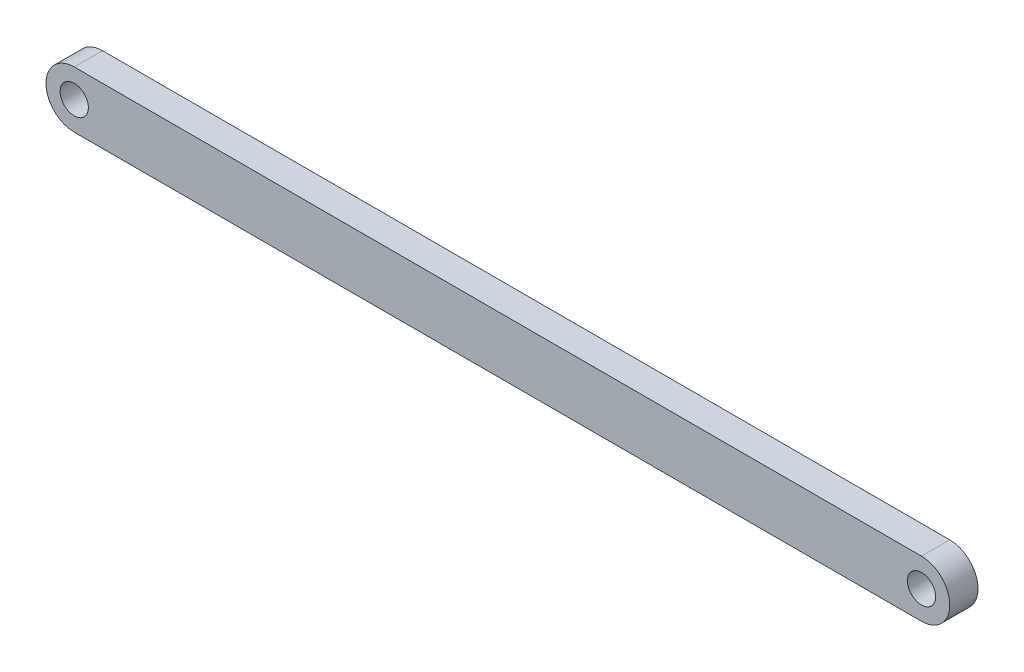
ISO-10303-21;
HEADER;
FILE_DESCRIPTION(('STEP AP214'),'2;1');
FILE_NAME('part.step','',(''),(''),'','','');
FILE_SCHEMA(('AUTOMOTIVE_DESIGN { 1 0 10303 214 1 1 1 1 }'));
ENDSEC;
DATA;
#1=APPLICATION_CONTEXT('core data for automotive mechanical design processes');
#2=APPLICATION_PROTOCOL_DEFINITION('international standard','automotive_design',2000,#1);
#3=PRODUCT_CONTEXT('',#1,'mechanical');
#4=PRODUCT('Part','Part','',(#3));
#5=PRODUCT_RELATED_PRODUCT_CATEGORY('part','',(#4));
#6=PRODUCT_DEFINITION_FORMATION('','',#4);
#7=PRODUCT_DEFINITION_CONTEXT('part definition',#1,'design');
#8=PRODUCT_DEFINITION('design','',#6,#7);
#9=PRODUCT_DEFINITION_SHAPE('','',#8);
#10=(LENGTH_UNIT() NAMED_UNIT(*) SI_UNIT(.MILLI.,.METRE.));
#11=(NAMED_UNIT(*) PLANE_ANGLE_UNIT() SI_UNIT($,.RADIAN.));
#12=(NAMED_UNIT(*) SI_UNIT($,.STERADIAN.) SOLID_ANGLE_UNIT());
#13=UNCERTAINTY_MEASURE_WITH_UNIT(LENGTH_MEASURE(1.E-05),#10,'distance_accuracy_value','');
#14=(GEOMETRIC_REPRESENTATION_CONTEXT(3) GLOBAL_UNCERTAINTY_ASSIGNED_CONTEXT((#13)) GLOBAL_UNIT_ASSIGNED_CONTEXT((#10,
#11,#12)) REPRESENTATION_CONTEXT('',''));
#15=CARTESIAN_POINT('',(0.,0.,0.));
#16=DIRECTION('',(0.,0.,1.));
#17=DIRECTION('',(1.,0.,0.));
#18=AXIS2_PLACEMENT_3D('',#15,#16,#17);
#19=CARTESIAN_POINT('',(150.,0.,10.));
#20=DIRECTION('',(0.,0.,-1.));
#21=DIRECTION('',(-1.,0.,0.));
#22=AXIS2_PLACEMENT_3D('',#19,#20,#21);
#23=CYLINDRICAL_SURFACE('',#22,10.);
#24=CARTESIAN_POINT('',(150.,0.,0.));
#25=DIRECTION('',(0.,0.,1.));
#26=DIRECTION('',(1.,0.,0.));
#27=AXIS2_PLACEMENT_3D('',#24,#25,#26);
#28=CIRCLE('',#27,10.);
#29=CARTESIAN_POINT('',(150.,-10.,0.));
#30=VERTEX_POINT('',#29);
#31=CARTESIAN_POINT('',(150.,10.,0.));
#32=VERTEX_POINT('',#31);
#33=EDGE_CURVE('E115',#30,#32,#28,.T.);
#34=ORIENTED_EDGE('',*,*,#33,.T.);
#35=DIRECTION('',(0.,0.,-1.));
#36=VECTOR('',#35,1.);
#37=CARTESIAN_POINT('',(150.,10.,10.));
#38=LINE('',#37,#36);
#39=CARTESIAN_POINT('',(150.,10.,10.));
#40=VERTEX_POINT('',#39);
#41=EDGE_CURVE('E11',#40,#32,#38,.T.);
#42=ORIENTED_EDGE('',*,*,#41,.F.);
#43=CARTESIAN_POINT('',(150.,0.,10.));
#44=DIRECTION('',(0.,0.,1.));
#45=DIRECTION('',(1.,0.,0.));
#46=AXIS2_PLACEMENT_3D('',#43,#44,#45);
#47=CIRCLE('',#46,10.);
#48=CARTESIAN_POINT('',(150.,-10.,10.));
#49=VERTEX_POINT('',#48);
#50=EDGE_CURVE('E86',#49,#40,#47,.T.);
#51=ORIENTED_EDGE('',*,*,#50,.F.);
#52=DIRECTION('',(0.,0.,-1.));
#53=VECTOR('',#52,1.);
#54=CARTESIAN_POINT('',(150.,-10.,10.));
#55=LINE('',#54,#53);
#56=EDGE_CURVE('E114',#49,#30,#55,.T.);
#57=ORIENTED_EDGE('',*,*,#56,.T.);
#58=EDGE_LOOP('',(#34,#42,#51,#57));
#59=FACE_BOUND('',#58,.T.);
#60=ADVANCED_FACE('F44',(#59),#23,.T.);
#61=CARTESIAN_POINT('',(0.,10.,10.));
#62=DIRECTION('',(0.,1.,0.));
#63=DIRECTION('',(0.,0.,1.));
#64=AXIS2_PLACEMENT_3D('',#61,#62,#63);
#65=PLANE('',#64);
#66=DIRECTION('',(1.,0.,0.));
#67=VECTOR('',#66,1.);
#68=CARTESIAN_POINT('',(0.,10.,0.));
#69=LINE('',#68,#67);
#70=CARTESIAN_POINT('',(-150.,10.,0.));
#71=VERTEX_POINT('',#70);
#72=EDGE_CURVE('E96',#71,#32,#69,.T.);
#73=ORIENTED_EDGE('',*,*,#72,.F.);
#74=DIRECTION('',(0.,0.,-1.));
#75=VECTOR('',#74,1.);
#76=CARTESIAN_POINT('',(-150.,10.,10.));
#77=LINE('',#76,#75);
#78=CARTESIAN_POINT('',(-150.,10.,10.));
#79=VERTEX_POINT('',#78);
#80=EDGE_CURVE('E52',#79,#71,#77,.T.);
#81=ORIENTED_EDGE('',*,*,#80,.F.);
#82=DIRECTION('',(1.,0.,0.));
#83=VECTOR('',#82,1.);
#84=CARTESIAN_POINT('',(0.,10.,10.));
#85=LINE('',#84,#83);
#86=EDGE_CURVE('E94',#79,#40,#85,.T.);
#87=ORIENTED_EDGE('',*,*,#86,.T.);
#88=ORIENTED_EDGE('',*,*,#41,.T.);
#89=EDGE_LOOP('',(#73,#81,#87,#88));
#90=FACE_BOUND('',#89,.T.);
#91=ADVANCED_FACE('F93',(#90),#65,.T.);
#92=CARTESIAN_POINT('',(-150.,0.,10.));
#93=DIRECTION('',(0.,0.,-1.));
#94=DIRECTION('',(-1.,0.,0.));
#95=AXIS2_PLACEMENT_3D('',#92,#93,#94);
#96=CYLINDRICAL_SURFACE('',#95,10.);
#97=CARTESIAN_POINT('',(-150.,0.,0.));
#98=DIRECTION('',(0.,0.,1.));
#99=DIRECTION('',(1.,0.,0.));
#100=AXIS2_PLACEMENT_3D('',#97,#98,#99);
#101=CIRCLE('',#100,10.);
#102=CARTESIAN_POINT('',(-150.,-10.,0.));
#103=VERTEX_POINT('',#102);
#104=EDGE_CURVE('E75',#71,#103,#101,.T.);
#105=ORIENTED_EDGE('',*,*,#104,.T.);
#106=DIRECTION('',(0.,0.,-1.));
#107=VECTOR('',#106,1.);
#108=CARTESIAN_POINT('',(-150.,-10.,10.));
#109=LINE('',#108,#107);
#110=CARTESIAN_POINT('',(-150.,-10.,10.));
#111=VERTEX_POINT('',#110);
#112=EDGE_CURVE('E97',#111,#103,#109,.T.);
#113=ORIENTED_EDGE('',*,*,#112,.F.);
#114=CARTESIAN_POINT('',(-150.,0.,10.));
#115=DIRECTION('',(0.,0.,1.));
#116=DIRECTION('',(1.,0.,0.));
#117=AXIS2_PLACEMENT_3D('',#114,#115,#116);
#118=CIRCLE('',#117,10.);
#119=EDGE_CURVE('E98',#79,#111,#118,.T.);
#120=ORIENTED_EDGE('',*,*,#119,.F.);
#121=ORIENTED_EDGE('',*,*,#80,.T.);
#122=EDGE_LOOP('',(#105,#113,#120,#121));
#123=FACE_BOUND('',#122,.T.);
#124=ADVANCED_FACE('F99',(#123),#96,.T.);
#125=CARTESIAN_POINT('',(150.,0.,10.));
#126=DIRECTION('',(0.,0.,-1.));
#127=DIRECTION('',(-1.,0.,0.));
#128=AXIS2_PLACEMENT_3D('',#125,#126,#127);
#129=CYLINDRICAL_SURFACE('',#128,5.00000000000002);
#130=CARTESIAN_POINT('',(150.,0.,10.));
#131=DIRECTION('',(0.,0.,1.));
#132=DIRECTION('',(1.,0.,0.));
#133=AXIS2_PLACEMENT_3D('',#130,#131,#132);
#134=CIRCLE('',#133,5.00000000000002);
#135=CARTESIAN_POINT('',(155.,0.,10.));
#136=VERTEX_POINT('',#135);
#137=EDGE_CURVE('E108',#136,#136,#134,.T.);
#138=ORIENTED_EDGE('',*,*,#137,.T.);
#139=EDGE_LOOP('',(#138));
#140=FACE_BOUND('',#139,.T.);
#141=CARTESIAN_POINT('',(150.,0.,0.));
#142=DIRECTION('',(0.,0.,1.));
#143=DIRECTION('',(1.,0.,0.));
#144=AXIS2_PLACEMENT_3D('',#141,#142,#143);
#145=CIRCLE('',#144,5.00000000000002);
#146=CARTESIAN_POINT('',(155.,0.,0.));
#147=VERTEX_POINT('',#146);
#148=EDGE_CURVE('E121',#147,#147,#145,.T.);
#149=ORIENTED_EDGE('',*,*,#148,.F.);
#150=EDGE_LOOP('',(#149));
#151=FACE_BOUND('',#150,.T.);
#152=ADVANCED_FACE('F140',(#140,#151),#129,.F.);
#153=CARTESIAN_POINT('',(0.,-10.,10.));
#154=DIRECTION('',(0.,1.,0.));
#155=DIRECTION('',(0.,0.,1.));
#156=AXIS2_PLACEMENT_3D('',#153,#154,#155);
#157=PLANE('',#156);
#158=DIRECTION('',(1.,0.,0.));
#159=VECTOR('',#158,1.);
#160=CARTESIAN_POINT('',(0.,-10.,0.));
#161=LINE('',#160,#159);
#162=EDGE_CURVE('E81',#103,#30,#161,.T.);
#163=ORIENTED_EDGE('',*,*,#162,.T.);
#164=ORIENTED_EDGE('',*,*,#56,.F.);
#165=DIRECTION('',(1.,0.,0.));
#166=VECTOR('',#165,1.);
#167=CARTESIAN_POINT('',(0.,-10.,10.));
#168=LINE('',#167,#166);
#169=EDGE_CURVE('E60',#111,#49,#168,.T.);
#170=ORIENTED_EDGE('',*,*,#169,.F.);
#171=ORIENTED_EDGE('',*,*,#112,.T.);
#172=EDGE_LOOP('',(#163,#164,#170,#171));
#173=FACE_BOUND('',#172,.T.);
#174=ADVANCED_FACE('F127',(#173),#157,.F.);
#175=CARTESIAN_POINT('',(-150.,0.,10.));
#176=DIRECTION('',(0.,0.,-1.));
#177=DIRECTION('',(-1.,0.,0.));
#178=AXIS2_PLACEMENT_3D('',#175,#176,#177);
#179=CYLINDRICAL_SURFACE('',#178,5.00000000000002);
#180=CARTESIAN_POINT('',(-150.,0.,10.));
#181=DIRECTION('',(0.,0.,1.));
#182=DIRECTION('',(1.,0.,0.));
#183=AXIS2_PLACEMENT_3D('',#180,#181,#182);
#184=CIRCLE('',#183,5.00000000000002);
#185=CARTESIAN_POINT('',(-145.,0.,10.));
#186=VERTEX_POINT('',#185);
#187=EDGE_CURVE('E111',#186,#186,#184,.T.);
#188=ORIENTED_EDGE('',*,*,#187,.T.);
#189=EDGE_LOOP('',(#188));
#190=FACE_BOUND('',#189,.T.);
#191=CARTESIAN_POINT('',(-150.,0.,0.));
#192=DIRECTION('',(0.,0.,1.));
#193=DIRECTION('',(1.,0.,0.));
#194=AXIS2_PLACEMENT_3D('',#191,#192,#193);
#195=CIRCLE('',#194,5.00000000000002);
#196=CARTESIAN_POINT('',(-145.,0.,0.));
#197=VERTEX_POINT('',#196);
#198=EDGE_CURVE('E104',#197,#197,#195,.T.);
#199=ORIENTED_EDGE('',*,*,#198,.F.);
#200=EDGE_LOOP('',(#199));
#201=FACE_BOUND('',#200,.T.);
#202=ADVANCED_FACE('F145',(#190,#201),#179,.F.);
#203=CARTESIAN_POINT('',(0.,0.,10.));
#204=DIRECTION('',(0.,0.,1.));
#205=DIRECTION('',(1.,0.,0.));
#206=AXIS2_PLACEMENT_3D('',#203,#204,#205);
#207=PLANE('',#206);
#208=ORIENTED_EDGE('',*,*,#50,.T.);
#209=ORIENTED_EDGE('',*,*,#86,.F.);
#210=ORIENTED_EDGE('',*,*,#119,.T.);
#211=ORIENTED_EDGE('',*,*,#169,.T.);
#212=EDGE_LOOP('',(#208,#209,#210,#211));
#213=FACE_BOUND('',#212,.T.);
#214=ORIENTED_EDGE('',*,*,#137,.F.);
#215=EDGE_LOOP('',(#214));
#216=FACE_BOUND('',#215,.T.);
#217=ORIENTED_EDGE('',*,*,#187,.F.);
#218=EDGE_LOOP('',(#217));
#219=FACE_BOUND('',#218,.T.);
#220=ADVANCED_FACE('F101',(#213,#216,#219),#207,.T.);
#221=CARTESIAN_POINT('',(0.,0.,0.));
#222=DIRECTION('',(0.,0.,1.));
#223=DIRECTION('',(1.,0.,0.));
#224=AXIS2_PLACEMENT_3D('',#221,#222,#223);
#225=PLANE('',#224);
#226=ORIENTED_EDGE('',*,*,#33,.F.);
#227=ORIENTED_EDGE('',*,*,#162,.F.);
#228=ORIENTED_EDGE('',*,*,#104,.F.);
#229=ORIENTED_EDGE('',*,*,#72,.T.);
#230=EDGE_LOOP('',(#226,#227,#228,#229));
#231=FACE_BOUND('',#230,.T.);
#232=ORIENTED_EDGE('',*,*,#148,.T.);
#233=EDGE_LOOP('',(#232));
#234=FACE_BOUND('',#233,.T.);
#235=ORIENTED_EDGE('',*,*,#198,.T.);
#236=EDGE_LOOP('',(#235));
#237=FACE_BOUND('',#236,.T.);
#238=ADVANCED_FACE('F130',(#231,#234,#237),#225,.F.);
#239=CLOSED_SHELL('',(#60,#91,#124,#152,#174,#202,#220,#238));
#240=MANIFOLD_SOLID_BREP('B2',#239);
#241=ADVANCED_BREP_SHAPE_REPRESENTATION('',(#18,#240),#14);
#242=SHAPE_DEFINITION_REPRESENTATION(#9,#241);
ENDSEC;
END-ISO-10303-21;
